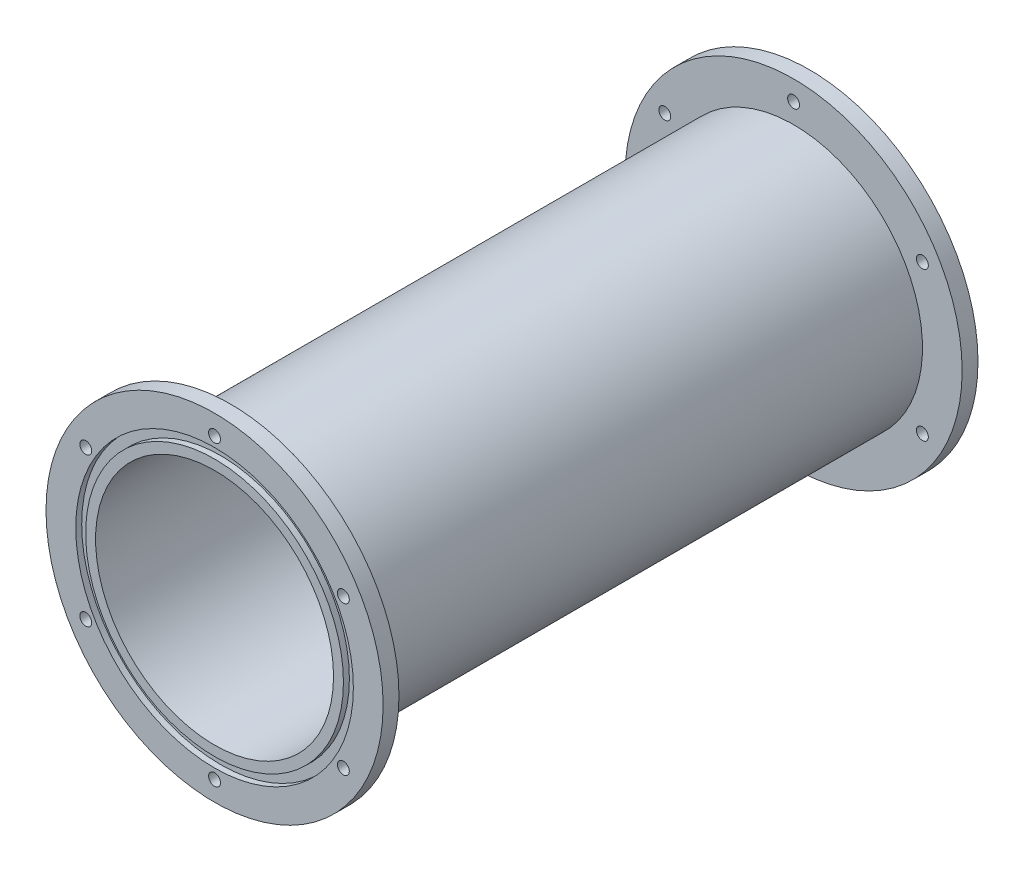
ISO-10303-21;
HEADER;
FILE_DESCRIPTION(('STEP AP214'),'2;1');
FILE_NAME('part.step','',(''),(''),'','','');
FILE_SCHEMA(('AUTOMOTIVE_DESIGN { 1 0 10303 214 1 1 1 1 }'));
ENDSEC;
DATA;
#1=APPLICATION_CONTEXT('core data for automotive mechanical design processes');
#2=APPLICATION_PROTOCOL_DEFINITION('international standard','automotive_design',2000,#1);
#3=PRODUCT_CONTEXT('',#1,'mechanical');
#4=PRODUCT('Part','Part','',(#3));
#5=PRODUCT_RELATED_PRODUCT_CATEGORY('part','',(#4));
#6=PRODUCT_DEFINITION_FORMATION('','',#4);
#7=PRODUCT_DEFINITION_CONTEXT('part definition',#1,'design');
#8=PRODUCT_DEFINITION('design','',#6,#7);
#9=PRODUCT_DEFINITION_SHAPE('','',#8);
#10=(LENGTH_UNIT() NAMED_UNIT(*) SI_UNIT(.MILLI.,.METRE.));
#11=(NAMED_UNIT(*) PLANE_ANGLE_UNIT() SI_UNIT($,.RADIAN.));
#12=(NAMED_UNIT(*) SI_UNIT($,.STERADIAN.) SOLID_ANGLE_UNIT());
#13=UNCERTAINTY_MEASURE_WITH_UNIT(LENGTH_MEASURE(1.E-05),#10,'distance_accuracy_value','');
#14=(GEOMETRIC_REPRESENTATION_CONTEXT(3) GLOBAL_UNCERTAINTY_ASSIGNED_CONTEXT((#13)) GLOBAL_UNIT_ASSIGNED_CONTEXT((#10,
#11,#12)) REPRESENTATION_CONTEXT('',''));
#15=CARTESIAN_POINT('',(0.,0.,0.));
#16=DIRECTION('',(0.,0.,1.));
#17=DIRECTION('',(1.,0.,0.));
#18=AXIS2_PLACEMENT_3D('',#15,#16,#17);
#19=CARTESIAN_POINT('',(0.,0.,-150.));
#20=DIRECTION('',(0.,0.,1.));
#21=DIRECTION('',(1.,0.,0.));
#22=AXIS2_PLACEMENT_3D('',#19,#20,#21);
#23=PLANE('',#22);
#24=CARTESIAN_POINT('',(0.,0.,-150.));
#25=DIRECTION('',(0.,0.,1.));
#26=DIRECTION('',(1.,0.,0.));
#27=AXIS2_PLACEMENT_3D('',#24,#25,#26);
#28=CIRCLE('',#27,60.);
#29=CARTESIAN_POINT('',(60.,0.,-150.));
#30=VERTEX_POINT('',#29);
#31=EDGE_CURVE('E51',#30,#30,#28,.T.);
#32=ORIENTED_EDGE('',*,*,#31,.T.);
#33=EDGE_LOOP('',(#32));
#34=FACE_BOUND('',#33,.T.);
#35=CARTESIAN_POINT('',(0.,0.,-150.));
#36=DIRECTION('',(0.,0.,1.));
#37=DIRECTION('',(1.,0.,0.));
#38=AXIS2_PLACEMENT_3D('',#35,#36,#37);
#39=CIRCLE('',#38,65.);
#40=CARTESIAN_POINT('',(65.,0.,-150.));
#41=VERTEX_POINT('',#40);
#42=EDGE_CURVE('E159',#41,#41,#39,.T.);
#43=ORIENTED_EDGE('',*,*,#42,.F.);
#44=EDGE_LOOP('',(#43));
#45=FACE_BOUND('',#44,.T.);
#46=ADVANCED_FACE('F36',(#34,#45),#23,.F.);
#47=CARTESIAN_POINT('',(0.,0.,150.));
#48=DIRECTION('',(0.,0.,-1.));
#49=DIRECTION('',(-1.,0.,0.));
#50=AXIS2_PLACEMENT_3D('',#47,#48,#49);
#51=CYLINDRICAL_SURFACE('',#50,65.);
#52=CARTESIAN_POINT('',(0.,0.,142.));
#53=DIRECTION('',(0.,0.,1.));
#54=DIRECTION('',(1.,0.,0.));
#55=AXIS2_PLACEMENT_3D('',#52,#53,#54);
#56=CIRCLE('',#55,65.);
#57=CARTESIAN_POINT('',(65.,0.,142.));
#58=VERTEX_POINT('',#57);
#59=EDGE_CURVE('E43',#58,#58,#56,.T.);
#60=ORIENTED_EDGE('',*,*,#59,.F.);
#61=EDGE_LOOP('',(#60));
#62=FACE_BOUND('',#61,.T.);
#63=CARTESIAN_POINT('',(0.,0.,-142.));
#64=DIRECTION('',(0.,0.,-1.));
#65=DIRECTION('',(-1.,0.,0.));
#66=AXIS2_PLACEMENT_3D('',#63,#64,#65);
#67=CIRCLE('',#66,65.);
#68=CARTESIAN_POINT('',(-65.,0.,-142.));
#69=VERTEX_POINT('',#68);
#70=EDGE_CURVE('E10',#69,#69,#67,.T.);
#71=ORIENTED_EDGE('',*,*,#70,.F.);
#72=EDGE_LOOP('',(#71));
#73=FACE_BOUND('',#72,.T.);
#74=ADVANCED_FACE('F38',(#62,#73),#51,.T.);
#75=CARTESIAN_POINT('',(0.,0.,150.));
#76=DIRECTION('',(0.,0.,1.));
#77=DIRECTION('',(1.,0.,0.));
#78=AXIS2_PLACEMENT_3D('',#75,#76,#77);
#79=PLANE('',#78);
#80=CARTESIAN_POINT('',(0.,0.,150.));
#81=DIRECTION('',(0.,0.,1.));
#82=DIRECTION('',(1.,0.,0.));
#83=AXIS2_PLACEMENT_3D('',#80,#81,#82);
#84=CIRCLE('',#83,60.);
#85=CARTESIAN_POINT('',(60.,0.,150.));
#86=VERTEX_POINT('',#85);
#87=EDGE_CURVE('E47',#86,#86,#84,.T.);
#88=ORIENTED_EDGE('',*,*,#87,.F.);
#89=EDGE_LOOP('',(#88));
#90=FACE_BOUND('',#89,.T.);
#91=CARTESIAN_POINT('',(0.,0.,150.));
#92=DIRECTION('',(0.,0.,1.));
#93=DIRECTION('',(1.,0.,0.));
#94=AXIS2_PLACEMENT_3D('',#91,#92,#93);
#95=CIRCLE('',#94,65.);
#96=CARTESIAN_POINT('',(65.,0.,150.));
#97=VERTEX_POINT('',#96);
#98=EDGE_CURVE('E105',#97,#97,#95,.T.);
#99=ORIENTED_EDGE('',*,*,#98,.T.);
#100=EDGE_LOOP('',(#99));
#101=FACE_BOUND('',#100,.T.);
#102=ADVANCED_FACE('F181',(#90,#101),#79,.T.);
#103=CARTESIAN_POINT('',(0.,0.,150.));
#104=DIRECTION('',(0.,0.,1.));
#105=DIRECTION('',(1.,0.,0.));
#106=AXIS2_PLACEMENT_3D('',#103,#104,#105);
#107=CIRCLE('',#106,70.);
#108=CARTESIAN_POINT('',(70.,0.,150.));
#109=VERTEX_POINT('',#108);
#110=EDGE_CURVE('E99',#109,#109,#107,.T.);
#111=ORIENTED_EDGE('',*,*,#110,.F.);
#112=EDGE_LOOP('',(#111));
#113=FACE_BOUND('',#112,.T.);
#114=CARTESIAN_POINT('',(-64.9519052838314,37.4999999999974,150.));
#115=DIRECTION('',(0.,0.,1.));
#116=DIRECTION('',(1.,0.,0.));
#117=AXIS2_PLACEMENT_3D('',#114,#115,#116);
#118=CIRCLE('',#117,3.);
#119=CARTESIAN_POINT('',(-61.9519052838314,37.4999999999974,150.));
#120=VERTEX_POINT('',#119);
#121=EDGE_CURVE('E93',#120,#120,#118,.T.);
#122=ORIENTED_EDGE('',*,*,#121,.F.);
#123=EDGE_LOOP('',(#122));
#124=FACE_BOUND('',#123,.T.);
#125=CARTESIAN_POINT('',(-64.9519052838284,-37.5000000000026,150.));
#126=DIRECTION('',(0.,0.,1.));
#127=DIRECTION('',(1.,0.,0.));
#128=AXIS2_PLACEMENT_3D('',#125,#126,#127);
#129=CIRCLE('',#128,3.);
#130=CARTESIAN_POINT('',(-61.9519052838284,-37.5000000000026,150.));
#131=VERTEX_POINT('',#130);
#132=EDGE_CURVE('E87',#131,#131,#129,.T.);
#133=ORIENTED_EDGE('',*,*,#132,.F.);
#134=EDGE_LOOP('',(#133));
#135=FACE_BOUND('',#134,.T.);
#136=CARTESIAN_POINT('',(5.94345372100232E-12,-75.,150.));
#137=DIRECTION('',(0.,0.,1.));
#138=DIRECTION('',(1.,0.,0.));
#139=AXIS2_PLACEMENT_3D('',#136,#137,#138);
#140=CIRCLE('',#139,3.);
#141=CARTESIAN_POINT('',(3.00000000000594,-75.,150.));
#142=VERTEX_POINT('',#141);
#143=EDGE_CURVE('E81',#142,#142,#140,.T.);
#144=ORIENTED_EDGE('',*,*,#143,.F.);
#145=EDGE_LOOP('',(#144));
#146=FACE_BOUND('',#145,.T.);
#147=CARTESIAN_POINT('',(64.9519052838374,-37.4999999999974,150.));
#148=DIRECTION('',(0.,0.,1.));
#149=DIRECTION('',(1.,0.,0.));
#150=AXIS2_PLACEMENT_3D('',#147,#148,#149);
#151=CIRCLE('',#150,3.00000000000001);
#152=CARTESIAN_POINT('',(67.9519052838374,-37.4999999999974,150.));
#153=VERTEX_POINT('',#152);
#154=EDGE_CURVE('E75',#153,#153,#151,.T.);
#155=ORIENTED_EDGE('',*,*,#154,.F.);
#156=EDGE_LOOP('',(#155));
#157=FACE_BOUND('',#156,.T.);
#158=CARTESIAN_POINT('',(64.9519052838344,37.5000000000026,150.));
#159=DIRECTION('',(0.,0.,1.));
#160=DIRECTION('',(1.,0.,0.));
#161=AXIS2_PLACEMENT_3D('',#158,#159,#160);
#162=CIRCLE('',#161,3.00000000000001);
#163=CARTESIAN_POINT('',(67.9519052838344,37.5000000000026,150.));
#164=VERTEX_POINT('',#163);
#165=EDGE_CURVE('E69',#164,#164,#162,.T.);
#166=ORIENTED_EDGE('',*,*,#165,.F.);
#167=EDGE_LOOP('',(#166));
#168=FACE_BOUND('',#167,.T.);
#169=CARTESIAN_POINT('',(0.,75.,150.));
#170=DIRECTION('',(0.,0.,1.));
#171=DIRECTION('',(1.,0.,0.));
#172=AXIS2_PLACEMENT_3D('',#169,#170,#171);
#173=CIRCLE('',#172,3.);
#174=CARTESIAN_POINT('',(3.,75.,150.));
#175=VERTEX_POINT('',#174);
#176=EDGE_CURVE('E63',#175,#175,#173,.T.);
#177=ORIENTED_EDGE('',*,*,#176,.F.);
#178=EDGE_LOOP('',(#177));
#179=FACE_BOUND('',#178,.T.);
#180=CARTESIAN_POINT('',(0.,0.,150.));
#181=DIRECTION('',(0.,0.,1.));
#182=DIRECTION('',(1.,0.,0.));
#183=AXIS2_PLACEMENT_3D('',#180,#181,#182);
#184=CIRCLE('',#183,85.);
#185=CARTESIAN_POINT('',(85.,0.,150.));
#186=VERTEX_POINT('',#185);
#187=EDGE_CURVE('E57',#186,#186,#184,.T.);
#188=ORIENTED_EDGE('',*,*,#187,.T.);
#189=EDGE_LOOP('',(#188));
#190=FACE_BOUND('',#189,.T.);
#191=ADVANCED_FACE('F186',(#113,#124,#135,#146,#157,#168,#179,#190),#79,.T.);
#192=CARTESIAN_POINT('',(0.,0.,-150.));
#193=DIRECTION('',(0.,0.,1.));
#194=DIRECTION('',(1.,0.,0.));
#195=AXIS2_PLACEMENT_3D('',#192,#193,#194);
#196=CIRCLE('',#195,70.);
#197=CARTESIAN_POINT('',(70.,0.,-150.));
#198=VERTEX_POINT('',#197);
#199=EDGE_CURVE('E153',#198,#198,#196,.T.);
#200=ORIENTED_EDGE('',*,*,#199,.T.);
#201=EDGE_LOOP('',(#200));
#202=FACE_BOUND('',#201,.T.);
#203=CARTESIAN_POINT('',(-64.9519052838314,37.4999999999974,-150.));
#204=DIRECTION('',(0.,0.,1.));
#205=DIRECTION('',(1.,0.,0.));
#206=AXIS2_PLACEMENT_3D('',#203,#204,#205);
#207=CIRCLE('',#206,3.);
#208=CARTESIAN_POINT('',(-61.9519052838314,37.4999999999974,-150.));
#209=VERTEX_POINT('',#208);
#210=EDGE_CURVE('E147',#209,#209,#207,.T.);
#211=ORIENTED_EDGE('',*,*,#210,.T.);
#212=EDGE_LOOP('',(#211));
#213=FACE_BOUND('',#212,.T.);
#214=CARTESIAN_POINT('',(5.94345372100232E-12,-75.,-150.));
#215=DIRECTION('',(0.,0.,1.));
#216=DIRECTION('',(1.,0.,0.));
#217=AXIS2_PLACEMENT_3D('',#214,#215,#216);
#218=CIRCLE('',#217,3.);
#219=CARTESIAN_POINT('',(3.00000000000594,-75.,-150.));
#220=VERTEX_POINT('',#219);
#221=EDGE_CURVE('E135',#220,#220,#218,.T.);
#222=ORIENTED_EDGE('',*,*,#221,.T.);
#223=EDGE_LOOP('',(#222));
#224=FACE_BOUND('',#223,.T.);
#225=CARTESIAN_POINT('',(64.9519052838344,37.5000000000026,-150.));
#226=DIRECTION('',(0.,0.,1.));
#227=DIRECTION('',(1.,0.,0.));
#228=AXIS2_PLACEMENT_3D('',#225,#226,#227);
#229=CIRCLE('',#228,3.00000000000001);
#230=CARTESIAN_POINT('',(67.9519052838344,37.5000000000026,-150.));
#231=VERTEX_POINT('',#230);
#232=EDGE_CURVE('E123',#231,#231,#229,.T.);
#233=ORIENTED_EDGE('',*,*,#232,.T.);
#234=EDGE_LOOP('',(#233));
#235=FACE_BOUND('',#234,.T.);
#236=CARTESIAN_POINT('',(0.,0.,-150.));
#237=DIRECTION('',(0.,0.,1.));
#238=DIRECTION('',(1.,0.,0.));
#239=AXIS2_PLACEMENT_3D('',#236,#237,#238);
#240=CIRCLE('',#239,85.);
#241=CARTESIAN_POINT('',(85.,0.,-150.));
#242=VERTEX_POINT('',#241);
#243=EDGE_CURVE('E111',#242,#242,#240,.T.);
#244=ORIENTED_EDGE('',*,*,#243,.F.);
#245=EDGE_LOOP('',(#244));
#246=FACE_BOUND('',#245,.T.);
#247=CARTESIAN_POINT('',(0.,75.,-150.));
#248=DIRECTION('',(0.,0.,1.));
#249=DIRECTION('',(1.,0.,0.));
#250=AXIS2_PLACEMENT_3D('',#247,#248,#249);
#251=CIRCLE('',#250,3.);
#252=CARTESIAN_POINT('',(3.,75.,-150.));
#253=VERTEX_POINT('',#252);
#254=EDGE_CURVE('E117',#253,#253,#251,.T.);
#255=ORIENTED_EDGE('',*,*,#254,.T.);
#256=EDGE_LOOP('',(#255));
#257=FACE_BOUND('',#256,.T.);
#258=CARTESIAN_POINT('',(64.9519052838374,-37.4999999999974,-150.));
#259=DIRECTION('',(0.,0.,1.));
#260=DIRECTION('',(1.,0.,0.));
#261=AXIS2_PLACEMENT_3D('',#258,#259,#260);
#262=CIRCLE('',#261,3.00000000000001);
#263=CARTESIAN_POINT('',(67.9519052838374,-37.4999999999974,-150.));
#264=VERTEX_POINT('',#263);
#265=EDGE_CURVE('E129',#264,#264,#262,.T.);
#266=ORIENTED_EDGE('',*,*,#265,.T.);
#267=EDGE_LOOP('',(#266));
#268=FACE_BOUND('',#267,.T.);
#269=CARTESIAN_POINT('',(-64.9519052838284,-37.5000000000026,-150.));
#270=DIRECTION('',(0.,0.,1.));
#271=DIRECTION('',(1.,0.,0.));
#272=AXIS2_PLACEMENT_3D('',#269,#270,#271);
#273=CIRCLE('',#272,3.);
#274=CARTESIAN_POINT('',(-61.9519052838284,-37.5000000000026,-150.));
#275=VERTEX_POINT('',#274);
#276=EDGE_CURVE('E141',#275,#275,#273,.T.);
#277=ORIENTED_EDGE('',*,*,#276,.T.);
#278=EDGE_LOOP('',(#277));
#279=FACE_BOUND('',#278,.T.);
#280=ADVANCED_FACE('F176',(#202,#213,#224,#235,#246,#257,#268,#279),#23,.F.);
#281=CARTESIAN_POINT('',(0.,0.,150.));
#282=DIRECTION('',(0.,0.,-1.));
#283=DIRECTION('',(-1.,0.,0.));
#284=AXIS2_PLACEMENT_3D('',#281,#282,#283);
#285=CYLINDRICAL_SURFACE('',#284,60.);
#286=ORIENTED_EDGE('',*,*,#87,.T.);
#287=EDGE_LOOP('',(#286));
#288=FACE_BOUND('',#287,.T.);
#289=ORIENTED_EDGE('',*,*,#31,.F.);
#290=EDGE_LOOP('',(#289));
#291=FACE_BOUND('',#290,.T.);
#292=ADVANCED_FACE('F185',(#288,#291),#285,.F.);
#293=CARTESIAN_POINT('',(0.,0.,142.));
#294=DIRECTION('',(0.,0.,1.));
#295=DIRECTION('',(1.,0.,0.));
#296=AXIS2_PLACEMENT_3D('',#293,#294,#295);
#297=CYLINDRICAL_SURFACE('',#296,85.);
#298=CARTESIAN_POINT('',(0.,0.,142.));
#299=DIRECTION('',(0.,0.,1.));
#300=DIRECTION('',(1.,0.,0.));
#301=AXIS2_PLACEMENT_3D('',#298,#299,#300);
#302=CIRCLE('',#301,85.);
#303=CARTESIAN_POINT('',(85.,0.,142.));
#304=VERTEX_POINT('',#303);
#305=EDGE_CURVE('E55',#304,#304,#302,.T.);
#306=ORIENTED_EDGE('',*,*,#305,.T.);
#307=EDGE_LOOP('',(#306));
#308=FACE_BOUND('',#307,.T.);
#309=ORIENTED_EDGE('',*,*,#187,.F.);
#310=EDGE_LOOP('',(#309));
#311=FACE_BOUND('',#310,.T.);
#312=ADVANCED_FACE('F192',(#308,#311),#297,.T.);
#313=CARTESIAN_POINT('',(0.,0.,142.));
#314=DIRECTION('',(0.,0.,1.));
#315=DIRECTION('',(1.,0.,0.));
#316=AXIS2_PLACEMENT_3D('',#313,#314,#315);
#317=PLANE('',#316);
#318=ORIENTED_EDGE('',*,*,#59,.T.);
#319=EDGE_LOOP('',(#318));
#320=FACE_BOUND('',#319,.T.);
#321=CARTESIAN_POINT('',(-64.9519052838314,37.4999999999974,142.));
#322=DIRECTION('',(0.,0.,1.));
#323=DIRECTION('',(1.,0.,0.));
#324=AXIS2_PLACEMENT_3D('',#321,#322,#323);
#325=CIRCLE('',#324,3.);
#326=CARTESIAN_POINT('',(-61.9519052838314,37.4999999999974,142.));
#327=VERTEX_POINT('',#326);
#328=EDGE_CURVE('E90',#327,#327,#325,.T.);
#329=ORIENTED_EDGE('',*,*,#328,.T.);
#330=EDGE_LOOP('',(#329));
#331=FACE_BOUND('',#330,.T.);
#332=CARTESIAN_POINT('',(-64.9519052838284,-37.5000000000026,142.));
#333=DIRECTION('',(0.,0.,1.));
#334=DIRECTION('',(1.,0.,0.));
#335=AXIS2_PLACEMENT_3D('',#332,#333,#334);
#336=CIRCLE('',#335,3.);
#337=CARTESIAN_POINT('',(-61.9519052838284,-37.5000000000026,142.));
#338=VERTEX_POINT('',#337);
#339=EDGE_CURVE('E84',#338,#338,#336,.T.);
#340=ORIENTED_EDGE('',*,*,#339,.T.);
#341=EDGE_LOOP('',(#340));
#342=FACE_BOUND('',#341,.T.);
#343=CARTESIAN_POINT('',(5.94345372100232E-12,-75.,142.));
#344=DIRECTION('',(0.,0.,1.));
#345=DIRECTION('',(1.,0.,0.));
#346=AXIS2_PLACEMENT_3D('',#343,#344,#345);
#347=CIRCLE('',#346,3.);
#348=CARTESIAN_POINT('',(3.00000000000594,-75.,142.));
#349=VERTEX_POINT('',#348);
#350=EDGE_CURVE('E78',#349,#349,#347,.T.);
#351=ORIENTED_EDGE('',*,*,#350,.T.);
#352=EDGE_LOOP('',(#351));
#353=FACE_BOUND('',#352,.T.);
#354=CARTESIAN_POINT('',(64.9519052838374,-37.4999999999974,142.));
#355=DIRECTION('',(0.,0.,1.));
#356=DIRECTION('',(1.,0.,0.));
#357=AXIS2_PLACEMENT_3D('',#354,#355,#356);
#358=CIRCLE('',#357,3.00000000000001);
#359=CARTESIAN_POINT('',(67.9519052838374,-37.4999999999974,142.));
#360=VERTEX_POINT('',#359);
#361=EDGE_CURVE('E72',#360,#360,#358,.T.);
#362=ORIENTED_EDGE('',*,*,#361,.T.);
#363=EDGE_LOOP('',(#362));
#364=FACE_BOUND('',#363,.T.);
#365=CARTESIAN_POINT('',(64.9519052838344,37.5000000000026,142.));
#366=DIRECTION('',(0.,0.,1.));
#367=DIRECTION('',(1.,0.,0.));
#368=AXIS2_PLACEMENT_3D('',#365,#366,#367);
#369=CIRCLE('',#368,3.00000000000001);
#370=CARTESIAN_POINT('',(67.9519052838344,37.5000000000026,142.));
#371=VERTEX_POINT('',#370);
#372=EDGE_CURVE('E66',#371,#371,#369,.T.);
#373=ORIENTED_EDGE('',*,*,#372,.T.);
#374=EDGE_LOOP('',(#373));
#375=FACE_BOUND('',#374,.T.);
#376=CARTESIAN_POINT('',(0.,75.,142.));
#377=DIRECTION('',(0.,0.,1.));
#378=DIRECTION('',(1.,0.,0.));
#379=AXIS2_PLACEMENT_3D('',#376,#377,#378);
#380=CIRCLE('',#379,3.);
#381=CARTESIAN_POINT('',(3.,75.,142.));
#382=VERTEX_POINT('',#381);
#383=EDGE_CURVE('E60',#382,#382,#380,.T.);
#384=ORIENTED_EDGE('',*,*,#383,.T.);
#385=EDGE_LOOP('',(#384));
#386=FACE_BOUND('',#385,.T.);
#387=ORIENTED_EDGE('',*,*,#305,.F.);
#388=EDGE_LOOP('',(#387));
#389=FACE_BOUND('',#388,.T.);
#390=ADVANCED_FACE('F282',(#320,#331,#342,#353,#364,#375,#386,#389),#317,.F.);
#391=CARTESIAN_POINT('',(0.,75.,142.));
#392=DIRECTION('',(0.,0.,1.));
#393=DIRECTION('',(1.,0.,0.));
#394=AXIS2_PLACEMENT_3D('',#391,#392,#393);
#395=CYLINDRICAL_SURFACE('',#394,3.);
#396=ORIENTED_EDGE('',*,*,#383,.F.);
#397=EDGE_LOOP('',(#396));
#398=FACE_BOUND('',#397,.T.);
#399=ORIENTED_EDGE('',*,*,#176,.T.);
#400=EDGE_LOOP('',(#399));
#401=FACE_BOUND('',#400,.T.);
#402=ADVANCED_FACE('F278',(#398,#401),#395,.F.);
#403=CARTESIAN_POINT('',(64.9519052838344,37.5000000000026,142.));
#404=DIRECTION('',(0.,0.,1.));
#405=DIRECTION('',(1.,0.,0.));
#406=AXIS2_PLACEMENT_3D('',#403,#404,#405);
#407=CYLINDRICAL_SURFACE('',#406,3.00000000000001);
#408=ORIENTED_EDGE('',*,*,#372,.F.);
#409=EDGE_LOOP('',(#408));
#410=FACE_BOUND('',#409,.T.);
#411=ORIENTED_EDGE('',*,*,#165,.T.);
#412=EDGE_LOOP('',(#411));
#413=FACE_BOUND('',#412,.T.);
#414=ADVANCED_FACE('F274',(#410,#413),#407,.F.);
#415=CARTESIAN_POINT('',(64.9519052838374,-37.4999999999974,142.));
#416=DIRECTION('',(0.,0.,1.));
#417=DIRECTION('',(1.,0.,0.));
#418=AXIS2_PLACEMENT_3D('',#415,#416,#417);
#419=CYLINDRICAL_SURFACE('',#418,3.00000000000001);
#420=ORIENTED_EDGE('',*,*,#361,.F.);
#421=EDGE_LOOP('',(#420));
#422=FACE_BOUND('',#421,.T.);
#423=ORIENTED_EDGE('',*,*,#154,.T.);
#424=EDGE_LOOP('',(#423));
#425=FACE_BOUND('',#424,.T.);
#426=ADVANCED_FACE('F270',(#422,#425),#419,.F.);
#427=CARTESIAN_POINT('',(5.94345372100232E-12,-75.,142.));
#428=DIRECTION('',(0.,0.,1.));
#429=DIRECTION('',(1.,0.,0.));
#430=AXIS2_PLACEMENT_3D('',#427,#428,#429);
#431=CYLINDRICAL_SURFACE('',#430,3.);
#432=ORIENTED_EDGE('',*,*,#350,.F.);
#433=EDGE_LOOP('',(#432));
#434=FACE_BOUND('',#433,.T.);
#435=ORIENTED_EDGE('',*,*,#143,.T.);
#436=EDGE_LOOP('',(#435));
#437=FACE_BOUND('',#436,.T.);
#438=ADVANCED_FACE('F266',(#434,#437),#431,.F.);
#439=CARTESIAN_POINT('',(-64.9519052838284,-37.5000000000026,142.));
#440=DIRECTION('',(0.,0.,1.));
#441=DIRECTION('',(1.,0.,0.));
#442=AXIS2_PLACEMENT_3D('',#439,#440,#441);
#443=CYLINDRICAL_SURFACE('',#442,3.);
#444=ORIENTED_EDGE('',*,*,#339,.F.);
#445=EDGE_LOOP('',(#444));
#446=FACE_BOUND('',#445,.T.);
#447=ORIENTED_EDGE('',*,*,#132,.T.);
#448=EDGE_LOOP('',(#447));
#449=FACE_BOUND('',#448,.T.);
#450=ADVANCED_FACE('F262',(#446,#449),#443,.F.);
#451=CARTESIAN_POINT('',(-64.9519052838314,37.4999999999974,142.));
#452=DIRECTION('',(0.,0.,1.));
#453=DIRECTION('',(1.,0.,0.));
#454=AXIS2_PLACEMENT_3D('',#451,#452,#453);
#455=CYLINDRICAL_SURFACE('',#454,3.);
#456=ORIENTED_EDGE('',*,*,#328,.F.);
#457=EDGE_LOOP('',(#456));
#458=FACE_BOUND('',#457,.T.);
#459=ORIENTED_EDGE('',*,*,#121,.T.);
#460=EDGE_LOOP('',(#459));
#461=FACE_BOUND('',#460,.T.);
#462=ADVANCED_FACE('F258',(#458,#461),#455,.F.);
#463=CARTESIAN_POINT('',(0.,0.,147.));
#464=DIRECTION('',(0.,0.,1.));
#465=DIRECTION('',(1.,0.,0.));
#466=AXIS2_PLACEMENT_3D('',#463,#464,#465);
#467=CYLINDRICAL_SURFACE('',#466,70.);
#468=CARTESIAN_POINT('',(0.,0.,147.));
#469=DIRECTION('',(0.,0.,1.));
#470=DIRECTION('',(1.,0.,0.));
#471=AXIS2_PLACEMENT_3D('',#468,#469,#470);
#472=CIRCLE('',#471,70.);
#473=CARTESIAN_POINT('',(70.,0.,147.));
#474=VERTEX_POINT('',#473);
#475=EDGE_CURVE('E96',#474,#474,#472,.T.);
#476=ORIENTED_EDGE('',*,*,#475,.F.);
#477=EDGE_LOOP('',(#476));
#478=FACE_BOUND('',#477,.T.);
#479=ORIENTED_EDGE('',*,*,#110,.T.);
#480=EDGE_LOOP('',(#479));
#481=FACE_BOUND('',#480,.T.);
#482=ADVANCED_FACE('F254',(#478,#481),#467,.F.);
#483=CARTESIAN_POINT('',(0.,0.,147.));
#484=DIRECTION('',(0.,0.,1.));
#485=DIRECTION('',(1.,0.,0.));
#486=AXIS2_PLACEMENT_3D('',#483,#484,#485);
#487=PLANE('',#486);
#488=CARTESIAN_POINT('',(0.,0.,147.));
#489=DIRECTION('',(0.,0.,1.));
#490=DIRECTION('',(1.,0.,0.));
#491=AXIS2_PLACEMENT_3D('',#488,#489,#490);
#492=CIRCLE('',#491,65.);
#493=CARTESIAN_POINT('',(65.,0.,147.));
#494=VERTEX_POINT('',#493);
#495=EDGE_CURVE('E102',#494,#494,#492,.T.);
#496=ORIENTED_EDGE('',*,*,#495,.F.);
#497=EDGE_LOOP('',(#496));
#498=FACE_BOUND('',#497,.T.);
#499=ORIENTED_EDGE('',*,*,#475,.T.);
#500=EDGE_LOOP('',(#499));
#501=FACE_BOUND('',#500,.T.);
#502=ADVANCED_FACE('F250',(#498,#501),#487,.T.);
#503=CARTESIAN_POINT('',(0.,0.,147.));
#504=DIRECTION('',(0.,0.,1.));
#505=DIRECTION('',(1.,0.,0.));
#506=AXIS2_PLACEMENT_3D('',#503,#504,#505);
#507=CYLINDRICAL_SURFACE('',#506,65.);
#508=ORIENTED_EDGE('',*,*,#495,.T.);
#509=EDGE_LOOP('',(#508));
#510=FACE_BOUND('',#509,.T.);
#511=ORIENTED_EDGE('',*,*,#98,.F.);
#512=EDGE_LOOP('',(#511));
#513=FACE_BOUND('',#512,.T.);
#514=ADVANCED_FACE('F244',(#510,#513),#507,.T.);
#515=CARTESIAN_POINT('',(0.,0.,-142.));
#516=DIRECTION('',(0.,0.,-1.));
#517=DIRECTION('',(1.,0.,0.));
#518=AXIS2_PLACEMENT_3D('',#515,#516,#517);
#519=PLANE('',#518);
#520=CARTESIAN_POINT('',(0.,0.,-142.));
#521=DIRECTION('',(0.,0.,1.));
#522=DIRECTION('',(1.,0.,0.));
#523=AXIS2_PLACEMENT_3D('',#520,#521,#522);
#524=CIRCLE('',#523,85.);
#525=CARTESIAN_POINT('',(85.,0.,-142.));
#526=VERTEX_POINT('',#525);
#527=EDGE_CURVE('E108',#526,#526,#524,.T.);
#528=ORIENTED_EDGE('',*,*,#527,.T.);
#529=EDGE_LOOP('',(#528));
#530=FACE_BOUND('',#529,.T.);
#531=CARTESIAN_POINT('',(0.,75.,-142.));
#532=DIRECTION('',(0.,0.,1.));
#533=DIRECTION('',(1.,0.,0.));
#534=AXIS2_PLACEMENT_3D('',#531,#532,#533);
#535=CIRCLE('',#534,3.);
#536=CARTESIAN_POINT('',(3.,75.,-142.));
#537=VERTEX_POINT('',#536);
#538=EDGE_CURVE('E114',#537,#537,#535,.T.);
#539=ORIENTED_EDGE('',*,*,#538,.F.);
#540=EDGE_LOOP('',(#539));
#541=FACE_BOUND('',#540,.T.);
#542=CARTESIAN_POINT('',(64.9519052838344,37.5000000000026,-142.));
#543=DIRECTION('',(0.,0.,1.));
#544=DIRECTION('',(1.,0.,0.));
#545=AXIS2_PLACEMENT_3D('',#542,#543,#544);
#546=CIRCLE('',#545,3.00000000000001);
#547=CARTESIAN_POINT('',(67.9519052838344,37.5000000000026,-142.));
#548=VERTEX_POINT('',#547);
#549=EDGE_CURVE('E120',#548,#548,#546,.T.);
#550=ORIENTED_EDGE('',*,*,#549,.F.);
#551=EDGE_LOOP('',(#550));
#552=FACE_BOUND('',#551,.T.);
#553=CARTESIAN_POINT('',(64.9519052838374,-37.4999999999974,-142.));
#554=DIRECTION('',(0.,0.,1.));
#555=DIRECTION('',(1.,0.,0.));
#556=AXIS2_PLACEMENT_3D('',#553,#554,#555);
#557=CIRCLE('',#556,3.00000000000001);
#558=CARTESIAN_POINT('',(67.9519052838374,-37.4999999999974,-142.));
#559=VERTEX_POINT('',#558);
#560=EDGE_CURVE('E126',#559,#559,#557,.T.);
#561=ORIENTED_EDGE('',*,*,#560,.F.);
#562=EDGE_LOOP('',(#561));
#563=FACE_BOUND('',#562,.T.);
#564=CARTESIAN_POINT('',(5.94345372100232E-12,-75.,-142.));
#565=DIRECTION('',(0.,0.,1.));
#566=DIRECTION('',(1.,0.,0.));
#567=AXIS2_PLACEMENT_3D('',#564,#565,#566);
#568=CIRCLE('',#567,3.);
#569=CARTESIAN_POINT('',(3.00000000000594,-75.,-142.));
#570=VERTEX_POINT('',#569);
#571=EDGE_CURVE('E132',#570,#570,#568,.T.);
#572=ORIENTED_EDGE('',*,*,#571,.F.);
#573=EDGE_LOOP('',(#572));
#574=FACE_BOUND('',#573,.T.);
#575=CARTESIAN_POINT('',(-64.9519052838284,-37.5000000000026,-142.));
#576=DIRECTION('',(0.,0.,1.));
#577=DIRECTION('',(1.,0.,0.));
#578=AXIS2_PLACEMENT_3D('',#575,#576,#577);
#579=CIRCLE('',#578,3.);
#580=CARTESIAN_POINT('',(-61.9519052838284,-37.5000000000026,-142.));
#581=VERTEX_POINT('',#580);
#582=EDGE_CURVE('E138',#581,#581,#579,.T.);
#583=ORIENTED_EDGE('',*,*,#582,.F.);
#584=EDGE_LOOP('',(#583));
#585=FACE_BOUND('',#584,.T.);
#586=CARTESIAN_POINT('',(-64.9519052838314,37.4999999999974,-142.));
#587=DIRECTION('',(0.,0.,1.));
#588=DIRECTION('',(1.,0.,0.));
#589=AXIS2_PLACEMENT_3D('',#586,#587,#588);
#590=CIRCLE('',#589,3.);
#591=CARTESIAN_POINT('',(-61.9519052838314,37.4999999999974,-142.));
#592=VERTEX_POINT('',#591);
#593=EDGE_CURVE('E144',#592,#592,#590,.T.);
#594=ORIENTED_EDGE('',*,*,#593,.F.);
#595=EDGE_LOOP('',(#594));
#596=FACE_BOUND('',#595,.T.);
#597=ORIENTED_EDGE('',*,*,#70,.T.);
#598=EDGE_LOOP('',(#597));
#599=FACE_BOUND('',#598,.T.);
#600=ADVANCED_FACE('F242',(#530,#541,#552,#563,#574,#585,#596,#599),#519,.F.);
#601=CARTESIAN_POINT('',(0.,0.,-142.));
#602=DIRECTION('',(0.,0.,-1.));
#603=DIRECTION('',(-1.,0.,0.));
#604=AXIS2_PLACEMENT_3D('',#601,#602,#603);
#605=CYLINDRICAL_SURFACE('',#604,85.);
#606=ORIENTED_EDGE('',*,*,#527,.F.);
#607=EDGE_LOOP('',(#606));
#608=FACE_BOUND('',#607,.T.);
#609=ORIENTED_EDGE('',*,*,#243,.T.);
#610=EDGE_LOOP('',(#609));
#611=FACE_BOUND('',#610,.T.);
#612=ADVANCED_FACE('F240',(#608,#611),#605,.T.);
#613=CARTESIAN_POINT('',(0.,75.,-142.));
#614=DIRECTION('',(0.,0.,-1.));
#615=DIRECTION('',(-1.,0.,0.));
#616=AXIS2_PLACEMENT_3D('',#613,#614,#615);
#617=CYLINDRICAL_SURFACE('',#616,3.);
#618=ORIENTED_EDGE('',*,*,#538,.T.);
#619=EDGE_LOOP('',(#618));
#620=FACE_BOUND('',#619,.T.);
#621=ORIENTED_EDGE('',*,*,#254,.F.);
#622=EDGE_LOOP('',(#621));
#623=FACE_BOUND('',#622,.T.);
#624=ADVANCED_FACE('F236',(#620,#623),#617,.F.);
#625=CARTESIAN_POINT('',(64.9519052838344,37.5000000000026,-142.));
#626=DIRECTION('',(0.,0.,-1.));
#627=DIRECTION('',(-1.,0.,0.));
#628=AXIS2_PLACEMENT_3D('',#625,#626,#627);
#629=CYLINDRICAL_SURFACE('',#628,3.00000000000001);
#630=ORIENTED_EDGE('',*,*,#549,.T.);
#631=EDGE_LOOP('',(#630));
#632=FACE_BOUND('',#631,.T.);
#633=ORIENTED_EDGE('',*,*,#232,.F.);
#634=EDGE_LOOP('',(#633));
#635=FACE_BOUND('',#634,.T.);
#636=ADVANCED_FACE('F232',(#632,#635),#629,.F.);
#637=CARTESIAN_POINT('',(64.9519052838374,-37.4999999999974,-142.));
#638=DIRECTION('',(0.,0.,-1.));
#639=DIRECTION('',(-1.,0.,0.));
#640=AXIS2_PLACEMENT_3D('',#637,#638,#639);
#641=CYLINDRICAL_SURFACE('',#640,3.00000000000001);
#642=ORIENTED_EDGE('',*,*,#560,.T.);
#643=EDGE_LOOP('',(#642));
#644=FACE_BOUND('',#643,.T.);
#645=ORIENTED_EDGE('',*,*,#265,.F.);
#646=EDGE_LOOP('',(#645));
#647=FACE_BOUND('',#646,.T.);
#648=ADVANCED_FACE('F225',(#644,#647),#641,.F.);
#649=CARTESIAN_POINT('',(5.94345372100232E-12,-75.,-142.));
#650=DIRECTION('',(0.,0.,-1.));
#651=DIRECTION('',(-1.,0.,0.));
#652=AXIS2_PLACEMENT_3D('',#649,#650,#651);
#653=CYLINDRICAL_SURFACE('',#652,3.);
#654=ORIENTED_EDGE('',*,*,#571,.T.);
#655=EDGE_LOOP('',(#654));
#656=FACE_BOUND('',#655,.T.);
#657=ORIENTED_EDGE('',*,*,#221,.F.);
#658=EDGE_LOOP('',(#657));
#659=FACE_BOUND('',#658,.T.);
#660=ADVANCED_FACE('F216',(#656,#659),#653,.F.);
#661=CARTESIAN_POINT('',(-64.9519052838284,-37.5000000000026,-142.));
#662=DIRECTION('',(0.,0.,-1.));
#663=DIRECTION('',(-1.,0.,0.));
#664=AXIS2_PLACEMENT_3D('',#661,#662,#663);
#665=CYLINDRICAL_SURFACE('',#664,3.);
#666=ORIENTED_EDGE('',*,*,#582,.T.);
#667=EDGE_LOOP('',(#666));
#668=FACE_BOUND('',#667,.T.);
#669=ORIENTED_EDGE('',*,*,#276,.F.);
#670=EDGE_LOOP('',(#669));
#671=FACE_BOUND('',#670,.T.);
#672=ADVANCED_FACE('F213',(#668,#671),#665,.F.);
#673=CARTESIAN_POINT('',(-64.9519052838314,37.4999999999974,-142.));
#674=DIRECTION('',(0.,0.,-1.));
#675=DIRECTION('',(-1.,0.,0.));
#676=AXIS2_PLACEMENT_3D('',#673,#674,#675);
#677=CYLINDRICAL_SURFACE('',#676,3.);
#678=ORIENTED_EDGE('',*,*,#593,.T.);
#679=EDGE_LOOP('',(#678));
#680=FACE_BOUND('',#679,.T.);
#681=ORIENTED_EDGE('',*,*,#210,.F.);
#682=EDGE_LOOP('',(#681));
#683=FACE_BOUND('',#682,.T.);
#684=ADVANCED_FACE('F215',(#680,#683),#677,.F.);
#685=CARTESIAN_POINT('',(0.,0.,-147.));
#686=DIRECTION('',(0.,0.,-1.));
#687=DIRECTION('',(1.,0.,0.));
#688=AXIS2_PLACEMENT_3D('',#685,#686,#687);
#689=PLANE('',#688);
#690=CARTESIAN_POINT('',(0.,0.,-147.));
#691=DIRECTION('',(0.,0.,1.));
#692=DIRECTION('',(1.,0.,0.));
#693=AXIS2_PLACEMENT_3D('',#690,#691,#692);
#694=CIRCLE('',#693,70.);
#695=CARTESIAN_POINT('',(70.,0.,-147.));
#696=VERTEX_POINT('',#695);
#697=EDGE_CURVE('E150',#696,#696,#694,.T.);
#698=ORIENTED_EDGE('',*,*,#697,.F.);
#699=EDGE_LOOP('',(#698));
#700=FACE_BOUND('',#699,.T.);
#701=CARTESIAN_POINT('',(0.,0.,-147.));
#702=DIRECTION('',(0.,0.,1.));
#703=DIRECTION('',(1.,0.,0.));
#704=AXIS2_PLACEMENT_3D('',#701,#702,#703);
#705=CIRCLE('',#704,65.);
#706=CARTESIAN_POINT('',(65.,0.,-147.));
#707=VERTEX_POINT('',#706);
#708=EDGE_CURVE('E156',#707,#707,#705,.T.);
#709=ORIENTED_EDGE('',*,*,#708,.T.);
#710=EDGE_LOOP('',(#709));
#711=FACE_BOUND('',#710,.T.);
#712=ADVANCED_FACE('F165',(#700,#711),#689,.T.);
#713=CARTESIAN_POINT('',(0.,0.,-147.));
#714=DIRECTION('',(0.,0.,-1.));
#715=DIRECTION('',(-1.,0.,0.));
#716=AXIS2_PLACEMENT_3D('',#713,#714,#715);
#717=CYLINDRICAL_SURFACE('',#716,70.);
#718=ORIENTED_EDGE('',*,*,#697,.T.);
#719=EDGE_LOOP('',(#718));
#720=FACE_BOUND('',#719,.T.);
#721=ORIENTED_EDGE('',*,*,#199,.F.);
#722=EDGE_LOOP('',(#721));
#723=FACE_BOUND('',#722,.T.);
#724=ADVANCED_FACE('F170',(#720,#723),#717,.F.);
#725=CARTESIAN_POINT('',(0.,0.,-147.));
#726=DIRECTION('',(0.,0.,-1.));
#727=DIRECTION('',(-1.,0.,0.));
#728=AXIS2_PLACEMENT_3D('',#725,#726,#727);
#729=CYLINDRICAL_SURFACE('',#728,65.);
#730=ORIENTED_EDGE('',*,*,#708,.F.);
#731=EDGE_LOOP('',(#730));
#732=FACE_BOUND('',#731,.T.);
#733=ORIENTED_EDGE('',*,*,#42,.T.);
#734=EDGE_LOOP('',(#733));
#735=FACE_BOUND('',#734,.T.);
#736=ADVANCED_FACE('F167',(#732,#735),#729,.T.);
#737=CLOSED_SHELL('',(#46,#74,#102,#191,#280,#292,#312,#390,#402,#414,#426,#438,#450,#462,#482,
#502,#514,#600,#612,#624,#636,#648,#660,#672,#684,#712,#724,#736));
#738=MANIFOLD_SOLID_BREP('B2',#737);
#739=ADVANCED_BREP_SHAPE_REPRESENTATION('',(#18,#738),#14);
#740=SHAPE_DEFINITION_REPRESENTATION(#9,#739);
ENDSEC;
END-ISO-10303-21;
